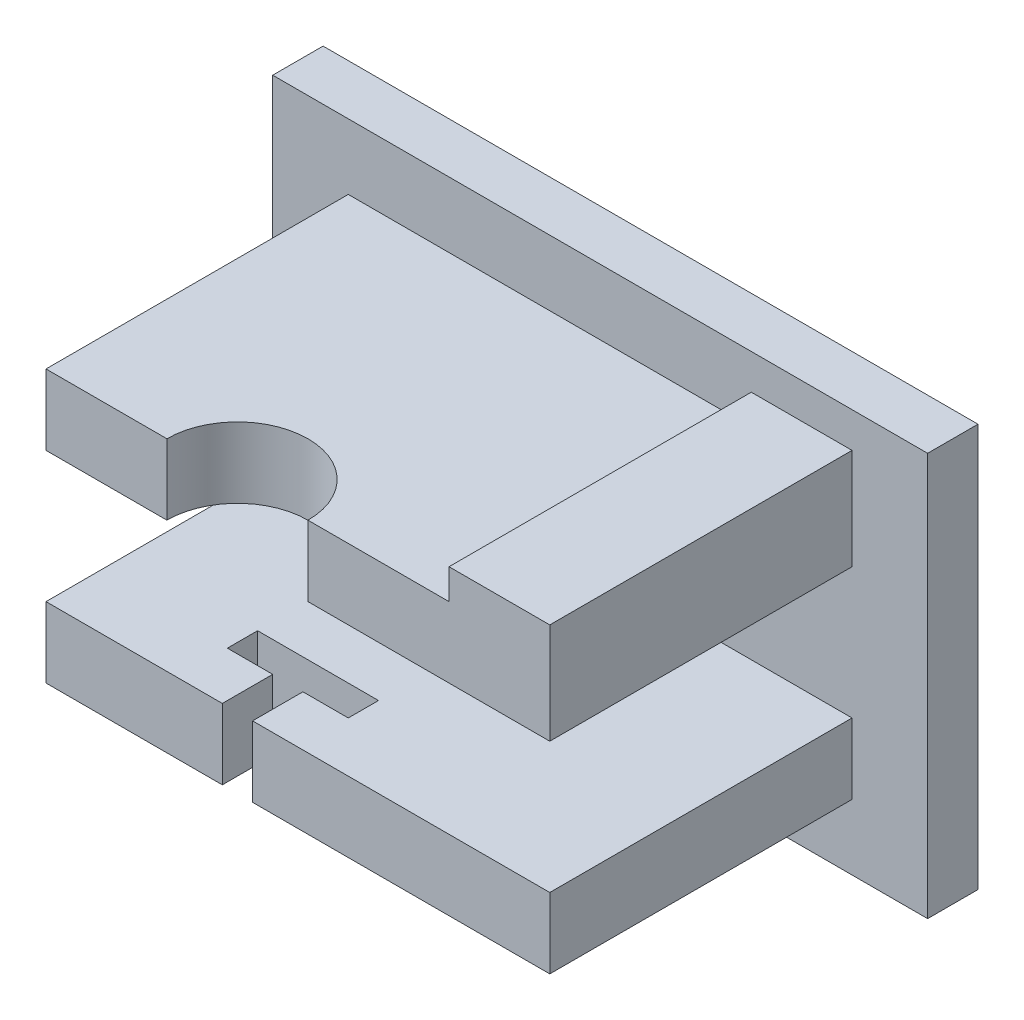
ISO-10303-21;
HEADER;
FILE_DESCRIPTION(('STEP AP214'),'2;1');
FILE_NAME('part.step','',(''),(''),'','','');
FILE_SCHEMA(('AUTOMOTIVE_DESIGN { 1 0 10303 214 1 1 1 1 }'));
ENDSEC;
DATA;
#1=APPLICATION_CONTEXT('core data for automotive mechanical design processes');
#2=APPLICATION_PROTOCOL_DEFINITION('international standard','automotive_design',2000,#1);
#3=PRODUCT_CONTEXT('',#1,'mechanical');
#4=PRODUCT('Part','Part','',(#3));
#5=PRODUCT_RELATED_PRODUCT_CATEGORY('part','',(#4));
#6=PRODUCT_DEFINITION_FORMATION('','',#4);
#7=PRODUCT_DEFINITION_CONTEXT('part definition',#1,'design');
#8=PRODUCT_DEFINITION('design','',#6,#7);
#9=PRODUCT_DEFINITION_SHAPE('','',#8);
#10=(LENGTH_UNIT() NAMED_UNIT(*) SI_UNIT(.MILLI.,.METRE.));
#11=(NAMED_UNIT(*) PLANE_ANGLE_UNIT() SI_UNIT($,.RADIAN.));
#12=(NAMED_UNIT(*) SI_UNIT($,.STERADIAN.) SOLID_ANGLE_UNIT());
#13=UNCERTAINTY_MEASURE_WITH_UNIT(LENGTH_MEASURE(1.E-05),#10,'distance_accuracy_value','');
#14=(GEOMETRIC_REPRESENTATION_CONTEXT(3) GLOBAL_UNCERTAINTY_ASSIGNED_CONTEXT((#13)) GLOBAL_UNIT_ASSIGNED_CONTEXT((#10,
#11,#12)) REPRESENTATION_CONTEXT('',''));
#15=CARTESIAN_POINT('',(0.,0.,0.));
#16=DIRECTION('',(0.,0.,1.));
#17=DIRECTION('',(1.,0.,0.));
#18=AXIS2_PLACEMENT_3D('',#15,#16,#17);
#19=CARTESIAN_POINT('',(0.,0.,35.));
#20=DIRECTION('',(0.,0.,1.));
#21=DIRECTION('',(1.,0.,0.));
#22=AXIS2_PLACEMENT_3D('',#19,#20,#21);
#23=PLANE('',#22);
#24=DIRECTION('',(1.,0.,0.));
#25=VECTOR('',#24,1.);
#26=CARTESIAN_POINT('',(0.,-13.5,35.));
#27=LINE('',#26,#25);
#28=CARTESIAN_POINT('',(-25.,-13.5,35.));
#29=VERTEX_POINT('',#28);
#30=CARTESIAN_POINT('',(-7.5,-13.5,35.));
#31=VERTEX_POINT('',#30);
#32=EDGE_CURVE('E362',#29,#31,#27,.T.);
#33=ORIENTED_EDGE('',*,*,#32,.T.);
#34=DIRECTION('',(0.,-1.,0.));
#35=VECTOR('',#34,1.);
#36=CARTESIAN_POINT('',(-7.5,5.86931687685299,35.));
#37=LINE('',#36,#35);
#38=CARTESIAN_POINT('',(-7.5,-6.5,35.));
#39=VERTEX_POINT('',#38);
#40=EDGE_CURVE('E335',#39,#31,#37,.T.);
#41=ORIENTED_EDGE('',*,*,#40,.F.);
#42=DIRECTION('',(1.,0.,0.));
#43=VECTOR('',#42,1.);
#44=CARTESIAN_POINT('',(0.,-6.5,35.));
#45=LINE('',#44,#43);
#46=CARTESIAN_POINT('',(-25.,-6.5,35.));
#47=VERTEX_POINT('',#46);
#48=EDGE_CURVE('E366',#47,#39,#45,.T.);
#49=ORIENTED_EDGE('',*,*,#48,.F.);
#50=DIRECTION('',(0.,1.,0.));
#51=VECTOR('',#50,1.);
#52=CARTESIAN_POINT('',(-25.,0.,35.));
#53=LINE('',#52,#51);
#54=EDGE_CURVE('E369',#29,#47,#53,.T.);
#55=ORIENTED_EDGE('',*,*,#54,.F.);
#56=EDGE_LOOP('',(#33,#41,#49,#55));
#57=FACE_BOUND('',#56,.T.);
#58=ADVANCED_FACE('F60',(#57),#23,.T.);
#59=CARTESIAN_POINT('',(0.,0.,35.));
#60=DIRECTION('',(0.,0.,1.));
#61=DIRECTION('',(1.,0.,0.));
#62=AXIS2_PLACEMENT_3D('',#59,#60,#61);
#63=PLANE('',#62);
#64=DIRECTION('',(0.,1.,0.));
#65=VECTOR('',#64,1.);
#66=CARTESIAN_POINT('',(0.999999999999996,-13.2989898732233,35.));
#67=LINE('',#66,#65);
#68=CARTESIAN_POINT('',(0.999999999999993,6.5,35.));
#69=VERTEX_POINT('',#68);
#70=CARTESIAN_POINT('',(0.999999999999992,13.5,35.));
#71=VERTEX_POINT('',#70);
#72=EDGE_CURVE('E12',#69,#71,#67,.T.);
#73=ORIENTED_EDGE('',*,*,#72,.F.);
#74=DIRECTION('',(-1.,0.,0.));
#75=VECTOR('',#74,1.);
#76=CARTESIAN_POINT('',(0.,6.5,35.));
#77=LINE('',#76,#75);
#78=CARTESIAN_POINT('',(25.,6.5,35.));
#79=VERTEX_POINT('',#78);
#80=EDGE_CURVE('E398',#79,#69,#77,.T.);
#81=ORIENTED_EDGE('',*,*,#80,.F.);
#82=DIRECTION('',(0.,1.,0.));
#83=VECTOR('',#82,1.);
#84=CARTESIAN_POINT('',(25.,0.,35.));
#85=LINE('',#84,#83);
#86=CARTESIAN_POINT('',(25.,16.5,35.));
#87=VERTEX_POINT('',#86);
#88=EDGE_CURVE('E401',#79,#87,#85,.T.);
#89=ORIENTED_EDGE('',*,*,#88,.T.);
#90=DIRECTION('',(-1.,0.,0.));
#91=VECTOR('',#90,1.);
#92=CARTESIAN_POINT('',(0.,16.5,35.));
#93=LINE('',#92,#91);
#94=CARTESIAN_POINT('',(15.,16.5,35.));
#95=VERTEX_POINT('',#94);
#96=EDGE_CURVE('E403',#87,#95,#93,.T.);
#97=ORIENTED_EDGE('',*,*,#96,.T.);
#98=DIRECTION('',(0.,-1.,0.));
#99=VECTOR('',#98,1.);
#100=CARTESIAN_POINT('',(15.,0.,35.));
#101=LINE('',#100,#99);
#102=CARTESIAN_POINT('',(15.,13.5,35.));
#103=VERTEX_POINT('',#102);
#104=EDGE_CURVE('E405',#95,#103,#101,.T.);
#105=ORIENTED_EDGE('',*,*,#104,.T.);
#106=DIRECTION('',(-1.,0.,0.));
#107=VECTOR('',#106,1.);
#108=CARTESIAN_POINT('',(0.,13.5,35.));
#109=LINE('',#108,#107);
#110=EDGE_CURVE('E408',#103,#71,#109,.T.);
#111=ORIENTED_EDGE('',*,*,#110,.T.);
#112=EDGE_LOOP('',(#73,#81,#89,#97,#105,#111));
#113=FACE_BOUND('',#112,.T.);
#114=ADVANCED_FACE('F306',(#113),#63,.T.);
#115=CARTESIAN_POINT('',(0.,0.,5.));
#116=DIRECTION('',(0.,0.,-1.));
#117=DIRECTION('',(-1.,0.,0.));
#118=AXIS2_PLACEMENT_3D('',#115,#116,#117);
#119=PLANE('',#118);
#120=DIRECTION('',(0.,1.,0.));
#121=VECTOR('',#120,1.);
#122=CARTESIAN_POINT('',(32.5,-20.,5.));
#123=LINE('',#122,#121);
#124=CARTESIAN_POINT('',(32.5,-20.,5.));
#125=VERTEX_POINT('',#124);
#126=CARTESIAN_POINT('',(32.5,20.,5.));
#127=VERTEX_POINT('',#126);
#128=EDGE_CURVE('E444',#125,#127,#123,.T.);
#129=ORIENTED_EDGE('',*,*,#128,.T.);
#130=DIRECTION('',(-1.,0.,0.));
#131=VECTOR('',#130,1.);
#132=CARTESIAN_POINT('',(-32.5,20.,5.));
#133=LINE('',#132,#131);
#134=CARTESIAN_POINT('',(-32.5,20.,5.));
#135=VERTEX_POINT('',#134);
#136=EDGE_CURVE('E447',#127,#135,#133,.T.);
#137=ORIENTED_EDGE('',*,*,#136,.T.);
#138=DIRECTION('',(0.,-1.,0.));
#139=VECTOR('',#138,1.);
#140=CARTESIAN_POINT('',(-32.5,-20.,5.));
#141=LINE('',#140,#139);
#142=CARTESIAN_POINT('',(-32.5,-20.,5.));
#143=VERTEX_POINT('',#142);
#144=EDGE_CURVE('E450',#135,#143,#141,.T.);
#145=ORIENTED_EDGE('',*,*,#144,.T.);
#146=DIRECTION('',(1.,0.,0.));
#147=VECTOR('',#146,1.);
#148=CARTESIAN_POINT('',(-32.5,-20.,5.));
#149=LINE('',#148,#147);
#150=EDGE_CURVE('E452',#143,#125,#149,.T.);
#151=ORIENTED_EDGE('',*,*,#150,.T.);
#152=EDGE_LOOP('',(#129,#137,#145,#151));
#153=FACE_BOUND('',#152,.T.);
#154=DIRECTION('',(-1.,0.,0.));
#155=VECTOR('',#154,1.);
#156=CARTESIAN_POINT('',(0.,6.5,5.));
#157=LINE('',#156,#155);
#158=CARTESIAN_POINT('',(25.,6.5,5.));
#159=VERTEX_POINT('',#158);
#160=CARTESIAN_POINT('',(-25.,6.49999999999999,5.));
#161=VERTEX_POINT('',#160);
#162=EDGE_CURVE('E413',#159,#161,#157,.T.);
#163=ORIENTED_EDGE('',*,*,#162,.T.);
#164=DIRECTION('',(0.,1.,0.));
#165=VECTOR('',#164,1.);
#166=CARTESIAN_POINT('',(-25.,0.,5.));
#167=LINE('',#166,#165);
#168=CARTESIAN_POINT('',(-25.,13.5,5.));
#169=VERTEX_POINT('',#168);
#170=EDGE_CURVE('E392',#161,#169,#167,.T.);
#171=ORIENTED_EDGE('',*,*,#170,.T.);
#172=DIRECTION('',(-1.,0.,0.));
#173=VECTOR('',#172,1.);
#174=CARTESIAN_POINT('',(0.,13.5,5.));
#175=LINE('',#174,#173);
#176=CARTESIAN_POINT('',(15.,13.5,5.));
#177=VERTEX_POINT('',#176);
#178=EDGE_CURVE('E397',#177,#169,#175,.T.);
#179=ORIENTED_EDGE('',*,*,#178,.F.);
#180=DIRECTION('',(0.,-1.,0.));
#181=VECTOR('',#180,1.);
#182=CARTESIAN_POINT('',(15.,0.,5.));
#183=LINE('',#182,#181);
#184=CARTESIAN_POINT('',(15.,16.5,5.));
#185=VERTEX_POINT('',#184);
#186=EDGE_CURVE('E421',#185,#177,#183,.T.);
#187=ORIENTED_EDGE('',*,*,#186,.F.);
#188=DIRECTION('',(-1.,0.,0.));
#189=VECTOR('',#188,1.);
#190=CARTESIAN_POINT('',(0.,16.5,5.));
#191=LINE('',#190,#189);
#192=CARTESIAN_POINT('',(25.,16.5,5.));
#193=VERTEX_POINT('',#192);
#194=EDGE_CURVE('E418',#193,#185,#191,.T.);
#195=ORIENTED_EDGE('',*,*,#194,.F.);
#196=DIRECTION('',(0.,1.,0.));
#197=VECTOR('',#196,1.);
#198=CARTESIAN_POINT('',(25.,0.,5.));
#199=LINE('',#198,#197);
#200=EDGE_CURVE('E415',#159,#193,#199,.T.);
#201=ORIENTED_EDGE('',*,*,#200,.F.);
#202=EDGE_LOOP('',(#163,#171,#179,#187,#195,#201));
#203=FACE_BOUND('',#202,.T.);
#204=DIRECTION('',(1.,0.,0.));
#205=VECTOR('',#204,1.);
#206=CARTESIAN_POINT('',(0.,-13.5,5.));
#207=LINE('',#206,#205);
#208=CARTESIAN_POINT('',(-25.,-13.5,5.));
#209=VERTEX_POINT('',#208);
#210=CARTESIAN_POINT('',(25.,-13.5,5.));
#211=VERTEX_POINT('',#210);
#212=EDGE_CURVE('E361',#209,#211,#207,.T.);
#213=ORIENTED_EDGE('',*,*,#212,.F.);
#214=DIRECTION('',(0.,1.,0.));
#215=VECTOR('',#214,1.);
#216=CARTESIAN_POINT('',(-25.,0.,5.));
#217=LINE('',#216,#215);
#218=CARTESIAN_POINT('',(-25.,-6.5,5.));
#219=VERTEX_POINT('',#218);
#220=EDGE_CURVE('E381',#209,#219,#217,.T.);
#221=ORIENTED_EDGE('',*,*,#220,.T.);
#222=DIRECTION('',(1.,0.,0.));
#223=VECTOR('',#222,1.);
#224=CARTESIAN_POINT('',(0.,-6.5,5.));
#225=LINE('',#224,#223);
#226=CARTESIAN_POINT('',(25.,-6.5,5.));
#227=VERTEX_POINT('',#226);
#228=EDGE_CURVE('E378',#219,#227,#225,.T.);
#229=ORIENTED_EDGE('',*,*,#228,.T.);
#230=DIRECTION('',(0.,1.,0.));
#231=VECTOR('',#230,1.);
#232=CARTESIAN_POINT('',(25.,0.,5.));
#233=LINE('',#232,#231);
#234=EDGE_CURVE('E375',#211,#227,#233,.T.);
#235=ORIENTED_EDGE('',*,*,#234,.F.);
#236=EDGE_LOOP('',(#213,#221,#229,#235));
#237=FACE_BOUND('',#236,.T.);
#238=ADVANCED_FACE('F314',(#153,#203,#237),#119,.F.);
#239=CARTESIAN_POINT('',(32.5,-20.,5.));
#240=DIRECTION('',(-1.,0.,0.));
#241=DIRECTION('',(0.,0.,1.));
#242=AXIS2_PLACEMENT_3D('',#239,#240,#241);
#243=PLANE('',#242);
#244=DIRECTION('',(0.,1.,0.));
#245=VECTOR('',#244,1.);
#246=CARTESIAN_POINT('',(32.5,-20.,0.));
#247=LINE('',#246,#245);
#248=CARTESIAN_POINT('',(32.5,-20.,0.));
#249=VERTEX_POINT('',#248);
#250=CARTESIAN_POINT('',(32.5,20.,0.));
#251=VERTEX_POINT('',#250);
#252=EDGE_CURVE('E443',#249,#251,#247,.T.);
#253=ORIENTED_EDGE('',*,*,#252,.T.);
#254=DIRECTION('',(0.,0.,-1.));
#255=VECTOR('',#254,1.);
#256=CARTESIAN_POINT('',(32.5,20.,5.));
#257=LINE('',#256,#255);
#258=EDGE_CURVE('E470',#127,#251,#257,.T.);
#259=ORIENTED_EDGE('',*,*,#258,.F.);
#260=ORIENTED_EDGE('',*,*,#128,.F.);
#261=DIRECTION('',(0.,0.,-1.));
#262=VECTOR('',#261,1.);
#263=CARTESIAN_POINT('',(32.5,-20.,5.));
#264=LINE('',#263,#262);
#265=EDGE_CURVE('E454',#125,#249,#264,.T.);
#266=ORIENTED_EDGE('',*,*,#265,.T.);
#267=EDGE_LOOP('',(#253,#259,#260,#266));
#268=FACE_BOUND('',#267,.T.);
#269=ADVANCED_FACE('F62',(#268),#243,.F.);
#270=CARTESIAN_POINT('',(-32.5,20.,5.));
#271=DIRECTION('',(0.,-1.,0.));
#272=DIRECTION('',(0.,0.,-1.));
#273=AXIS2_PLACEMENT_3D('',#270,#271,#272);
#274=PLANE('',#273);
#275=DIRECTION('',(-1.,0.,0.));
#276=VECTOR('',#275,1.);
#277=CARTESIAN_POINT('',(-32.5,20.,0.));
#278=LINE('',#277,#276);
#279=CARTESIAN_POINT('',(-32.5,20.,0.));
#280=VERTEX_POINT('',#279);
#281=EDGE_CURVE('E457',#251,#280,#278,.T.);
#282=ORIENTED_EDGE('',*,*,#281,.T.);
#283=DIRECTION('',(0.,0.,-1.));
#284=VECTOR('',#283,1.);
#285=CARTESIAN_POINT('',(-32.5,20.,5.));
#286=LINE('',#285,#284);
#287=EDGE_CURVE('E467',#135,#280,#286,.T.);
#288=ORIENTED_EDGE('',*,*,#287,.F.);
#289=ORIENTED_EDGE('',*,*,#136,.F.);
#290=ORIENTED_EDGE('',*,*,#258,.T.);
#291=EDGE_LOOP('',(#282,#288,#289,#290));
#292=FACE_BOUND('',#291,.T.);
#293=ADVANCED_FACE('F528',(#292),#274,.F.);
#294=CARTESIAN_POINT('',(-32.5,-20.,5.));
#295=DIRECTION('',(1.,0.,0.));
#296=DIRECTION('',(0.,0.,-1.));
#297=AXIS2_PLACEMENT_3D('',#294,#295,#296);
#298=PLANE('',#297);
#299=DIRECTION('',(0.,-1.,0.));
#300=VECTOR('',#299,1.);
#301=CARTESIAN_POINT('',(-32.5,-20.,0.));
#302=LINE('',#301,#300);
#303=CARTESIAN_POINT('',(-32.5,-20.,0.));
#304=VERTEX_POINT('',#303);
#305=EDGE_CURVE('E459',#280,#304,#302,.T.);
#306=ORIENTED_EDGE('',*,*,#305,.T.);
#307=DIRECTION('',(0.,0.,-1.));
#308=VECTOR('',#307,1.);
#309=CARTESIAN_POINT('',(-32.5,-20.,5.));
#310=LINE('',#309,#308);
#311=EDGE_CURVE('E464',#143,#304,#310,.T.);
#312=ORIENTED_EDGE('',*,*,#311,.F.);
#313=ORIENTED_EDGE('',*,*,#144,.F.);
#314=ORIENTED_EDGE('',*,*,#287,.T.);
#315=EDGE_LOOP('',(#306,#312,#313,#314));
#316=FACE_BOUND('',#315,.T.);
#317=ADVANCED_FACE('F525',(#316),#298,.F.);
#318=CARTESIAN_POINT('',(-32.5,-20.,5.));
#319=DIRECTION('',(0.,1.,0.));
#320=DIRECTION('',(0.,0.,1.));
#321=AXIS2_PLACEMENT_3D('',#318,#319,#320);
#322=PLANE('',#321);
#323=DIRECTION('',(1.,0.,0.));
#324=VECTOR('',#323,1.);
#325=CARTESIAN_POINT('',(-32.5,-20.,0.));
#326=LINE('',#325,#324);
#327=EDGE_CURVE('E448',#304,#249,#326,.T.);
#328=ORIENTED_EDGE('',*,*,#327,.T.);
#329=ORIENTED_EDGE('',*,*,#265,.F.);
#330=ORIENTED_EDGE('',*,*,#150,.F.);
#331=ORIENTED_EDGE('',*,*,#311,.T.);
#332=EDGE_LOOP('',(#328,#329,#330,#331));
#333=FACE_BOUND('',#332,.T.);
#334=ADVANCED_FACE('F521',(#333),#322,.F.);
#335=CARTESIAN_POINT('',(0.,0.,0.));
#336=DIRECTION('',(0.,0.,-1.));
#337=DIRECTION('',(-1.,0.,0.));
#338=AXIS2_PLACEMENT_3D('',#335,#336,#337);
#339=PLANE('',#338);
#340=ORIENTED_EDGE('',*,*,#252,.F.);
#341=ORIENTED_EDGE('',*,*,#327,.F.);
#342=ORIENTED_EDGE('',*,*,#305,.F.);
#343=ORIENTED_EDGE('',*,*,#281,.F.);
#344=EDGE_LOOP('',(#340,#341,#342,#343));
#345=FACE_BOUND('',#344,.T.);
#346=ADVANCED_FACE('F515',(#345),#339,.T.);
#347=CARTESIAN_POINT('',(-25.,0.,35.));
#348=DIRECTION('',(-1.,0.,0.));
#349=DIRECTION('',(0.,-1.,0.));
#350=AXIS2_PLACEMENT_3D('',#347,#348,#349);
#351=PLANE('',#350);
#352=ORIENTED_EDGE('',*,*,#170,.F.);
#353=DIRECTION('',(0.,0.,-1.));
#354=VECTOR('',#353,1.);
#355=CARTESIAN_POINT('',(-25.,6.49999999999999,35.));
#356=LINE('',#355,#354);
#357=CARTESIAN_POINT('',(-25.,6.49999999999999,35.));
#358=VERTEX_POINT('',#357);
#359=EDGE_CURVE('E440',#358,#161,#356,.T.);
#360=ORIENTED_EDGE('',*,*,#359,.F.);
#361=DIRECTION('',(0.,1.,0.));
#362=VECTOR('',#361,1.);
#363=CARTESIAN_POINT('',(-25.,0.,35.));
#364=LINE('',#363,#362);
#365=CARTESIAN_POINT('',(-25.,13.5,35.));
#366=VERTEX_POINT('',#365);
#367=EDGE_CURVE('E393',#358,#366,#364,.T.);
#368=ORIENTED_EDGE('',*,*,#367,.T.);
#369=DIRECTION('',(0.,0.,-1.));
#370=VECTOR('',#369,1.);
#371=CARTESIAN_POINT('',(-25.,13.5,35.));
#372=LINE('',#371,#370);
#373=EDGE_CURVE('E411',#366,#169,#372,.T.);
#374=ORIENTED_EDGE('',*,*,#373,.T.);
#375=EDGE_LOOP('',(#352,#360,#368,#374));
#376=FACE_BOUND('',#375,.T.);
#377=ADVANCED_FACE('F483',(#376),#351,.T.);
#378=CARTESIAN_POINT('',(0.,6.5,35.));
#379=DIRECTION('',(0.,-1.,0.));
#380=DIRECTION('',(1.,0.,0.));
#381=AXIS2_PLACEMENT_3D('',#378,#379,#380);
#382=PLANE('',#381);
#383=CARTESIAN_POINT('',(-6.00000000000001,6.5,35.));
#384=DIRECTION('',(0.,-1.,0.));
#385=DIRECTION('',(1.,0.,0.));
#386=AXIS2_PLACEMENT_3D('',#383,#384,#385);
#387=CIRCLE('',#386,7.);
#388=CARTESIAN_POINT('',(-13.,6.49999999999999,35.));
#389=VERTEX_POINT('',#388);
#390=EDGE_CURVE('E357',#69,#389,#387,.F.);
#391=ORIENTED_EDGE('',*,*,#390,.T.);
#392=EDGE_CURVE('E396',#389,#358,#77,.T.);
#393=ORIENTED_EDGE('',*,*,#392,.T.);
#394=ORIENTED_EDGE('',*,*,#359,.T.);
#395=ORIENTED_EDGE('',*,*,#162,.F.);
#396=DIRECTION('',(0.,0.,-1.));
#397=VECTOR('',#396,1.);
#398=CARTESIAN_POINT('',(25.,6.5,35.));
#399=LINE('',#398,#397);
#400=EDGE_CURVE('E437',#79,#159,#399,.T.);
#401=ORIENTED_EDGE('',*,*,#400,.F.);
#402=ORIENTED_EDGE('',*,*,#80,.T.);
#403=EDGE_LOOP('',(#391,#393,#394,#395,#401,#402));
#404=FACE_BOUND('',#403,.T.);
#405=ADVANCED_FACE('F476',(#404),#382,.T.);
#406=CARTESIAN_POINT('',(25.,0.,35.));
#407=DIRECTION('',(-1.,0.,0.));
#408=DIRECTION('',(0.,0.,1.));
#409=AXIS2_PLACEMENT_3D('',#406,#407,#408);
#410=PLANE('',#409);
#411=ORIENTED_EDGE('',*,*,#200,.T.);
#412=DIRECTION('',(0.,0.,-1.));
#413=VECTOR('',#412,1.);
#414=CARTESIAN_POINT('',(25.,16.5,35.));
#415=LINE('',#414,#413);
#416=EDGE_CURVE('E434',#87,#193,#415,.T.);
#417=ORIENTED_EDGE('',*,*,#416,.F.);
#418=ORIENTED_EDGE('',*,*,#88,.F.);
#419=ORIENTED_EDGE('',*,*,#400,.T.);
#420=EDGE_LOOP('',(#411,#417,#418,#419));
#421=FACE_BOUND('',#420,.T.);
#422=ADVANCED_FACE('F490',(#421),#410,.F.);
#423=CARTESIAN_POINT('',(0.,16.5,35.));
#424=DIRECTION('',(0.,-1.,0.));
#425=DIRECTION('',(0.,0.,-1.));
#426=AXIS2_PLACEMENT_3D('',#423,#424,#425);
#427=PLANE('',#426);
#428=ORIENTED_EDGE('',*,*,#194,.T.);
#429=DIRECTION('',(0.,0.,-1.));
#430=VECTOR('',#429,1.);
#431=CARTESIAN_POINT('',(15.,16.5,35.));
#432=LINE('',#431,#430);
#433=EDGE_CURVE('E431',#95,#185,#432,.T.);
#434=ORIENTED_EDGE('',*,*,#433,.F.);
#435=ORIENTED_EDGE('',*,*,#96,.F.);
#436=ORIENTED_EDGE('',*,*,#416,.T.);
#437=EDGE_LOOP('',(#428,#434,#435,#436));
#438=FACE_BOUND('',#437,.T.);
#439=ADVANCED_FACE('F500',(#438),#427,.F.);
#440=CARTESIAN_POINT('',(15.,0.,35.));
#441=DIRECTION('',(1.,0.,0.));
#442=DIRECTION('',(0.,0.,-1.));
#443=AXIS2_PLACEMENT_3D('',#440,#441,#442);
#444=PLANE('',#443);
#445=ORIENTED_EDGE('',*,*,#186,.T.);
#446=DIRECTION('',(0.,0.,-1.));
#447=VECTOR('',#446,1.);
#448=CARTESIAN_POINT('',(15.,13.5,35.));
#449=LINE('',#448,#447);
#450=EDGE_CURVE('E428',#103,#177,#449,.T.);
#451=ORIENTED_EDGE('',*,*,#450,.F.);
#452=ORIENTED_EDGE('',*,*,#104,.F.);
#453=ORIENTED_EDGE('',*,*,#433,.T.);
#454=EDGE_LOOP('',(#445,#451,#452,#453));
#455=FACE_BOUND('',#454,.T.);
#456=ADVANCED_FACE('F496',(#455),#444,.F.);
#457=CARTESIAN_POINT('',(0.,13.5,35.));
#458=DIRECTION('',(0.,-1.,0.));
#459=DIRECTION('',(1.,0.,0.));
#460=AXIS2_PLACEMENT_3D('',#457,#458,#459);
#461=PLANE('',#460);
#462=CARTESIAN_POINT('',(-13.,13.5,35.));
#463=VERTEX_POINT('',#462);
#464=EDGE_CURVE('E407',#463,#366,#109,.T.);
#465=ORIENTED_EDGE('',*,*,#464,.F.);
#466=CARTESIAN_POINT('',(-6.00000000000001,13.5,35.));
#467=DIRECTION('',(0.,1.,0.));
#468=DIRECTION('',(-1.,0.,0.));
#469=AXIS2_PLACEMENT_3D('',#466,#467,#468);
#470=CIRCLE('',#469,7.);
#471=EDGE_CURVE('E82',#71,#463,#470,.T.);
#472=ORIENTED_EDGE('',*,*,#471,.F.);
#473=ORIENTED_EDGE('',*,*,#110,.F.);
#474=ORIENTED_EDGE('',*,*,#450,.T.);
#475=ORIENTED_EDGE('',*,*,#178,.T.);
#476=ORIENTED_EDGE('',*,*,#373,.F.);
#477=EDGE_LOOP('',(#465,#472,#473,#474,#475,#476));
#478=FACE_BOUND('',#477,.T.);
#479=ADVANCED_FACE('F303',(#478),#461,.F.);
#480=DIRECTION('',(0.,1.,0.));
#481=VECTOR('',#480,1.);
#482=CARTESIAN_POINT('',(-13.,-13.2989898732233,35.));
#483=LINE('',#482,#481);
#484=EDGE_CURVE('E68',#463,#389,#483,.F.);
#485=ORIENTED_EDGE('',*,*,#484,.F.);
#486=ORIENTED_EDGE('',*,*,#464,.T.);
#487=ORIENTED_EDGE('',*,*,#367,.F.);
#488=ORIENTED_EDGE('',*,*,#392,.F.);
#489=EDGE_LOOP('',(#485,#486,#487,#488));
#490=FACE_BOUND('',#489,.T.);
#491=ADVANCED_FACE('F295',(#490),#63,.T.);
#492=CARTESIAN_POINT('',(0.,-13.5,35.));
#493=DIRECTION('',(0.,1.,0.));
#494=DIRECTION('',(0.,0.,1.));
#495=AXIS2_PLACEMENT_3D('',#492,#493,#494);
#496=PLANE('',#495);
#497=CARTESIAN_POINT('',(-4.5,-13.5,35.));
#498=VERTEX_POINT('',#497);
#499=CARTESIAN_POINT('',(25.,-13.5,35.));
#500=VERTEX_POINT('',#499);
#501=EDGE_CURVE('E292',#498,#500,#27,.T.);
#502=ORIENTED_EDGE('',*,*,#501,.F.);
#503=DIRECTION('',(0.,0.,1.));
#504=VECTOR('',#503,1.);
#505=CARTESIAN_POINT('',(-4.5,-13.5,30.));
#506=LINE('',#505,#504);
#507=CARTESIAN_POINT('',(-4.5,-13.5,30.));
#508=VERTEX_POINT('',#507);
#509=EDGE_CURVE('E339',#508,#498,#506,.T.);
#510=ORIENTED_EDGE('',*,*,#509,.F.);
#511=DIRECTION('',(1.,0.,0.));
#512=VECTOR('',#511,1.);
#513=CARTESIAN_POINT('',(0.,-13.5,30.));
#514=LINE('',#513,#512);
#515=CARTESIAN_POINT('',(0.,-13.5,30.));
#516=VERTEX_POINT('',#515);
#517=EDGE_CURVE('E265',#508,#516,#514,.T.);
#518=ORIENTED_EDGE('',*,*,#517,.T.);
#519=DIRECTION('',(0.,0.,1.));
#520=VECTOR('',#519,1.);
#521=CARTESIAN_POINT('',(0.,-13.5,0.));
#522=LINE('',#521,#520);
#523=CARTESIAN_POINT('',(0.,-13.5,27.));
#524=VERTEX_POINT('',#523);
#525=EDGE_CURVE('E238',#524,#516,#522,.T.);
#526=ORIENTED_EDGE('',*,*,#525,.F.);
#527=DIRECTION('',(1.,0.,0.));
#528=VECTOR('',#527,1.);
#529=CARTESIAN_POINT('',(0.,-13.5,27.));
#530=LINE('',#529,#528);
#531=CARTESIAN_POINT('',(-12.,-13.5,27.));
#532=VERTEX_POINT('',#531);
#533=EDGE_CURVE('E247',#532,#524,#530,.T.);
#534=ORIENTED_EDGE('',*,*,#533,.F.);
#535=DIRECTION('',(0.,0.,1.));
#536=VECTOR('',#535,1.);
#537=CARTESIAN_POINT('',(-12.,-13.5,0.));
#538=LINE('',#537,#536);
#539=CARTESIAN_POINT('',(-12.,-13.5,30.));
#540=VERTEX_POINT('',#539);
#541=EDGE_CURVE('E253',#532,#540,#538,.T.);
#542=ORIENTED_EDGE('',*,*,#541,.T.);
#543=CARTESIAN_POINT('',(-7.5,-13.5,30.));
#544=VERTEX_POINT('',#543);
#545=EDGE_CURVE('E270',#540,#544,#514,.T.);
#546=ORIENTED_EDGE('',*,*,#545,.T.);
#547=DIRECTION('',(0.,0.,1.));
#548=VECTOR('',#547,1.);
#549=CARTESIAN_POINT('',(-7.5,-13.5,30.));
#550=LINE('',#549,#548);
#551=EDGE_CURVE('E255',#544,#31,#550,.T.);
#552=ORIENTED_EDGE('',*,*,#551,.T.);
#553=ORIENTED_EDGE('',*,*,#32,.F.);
#554=DIRECTION('',(0.,0.,-1.));
#555=VECTOR('',#554,1.);
#556=CARTESIAN_POINT('',(-25.,-13.5,35.));
#557=LINE('',#556,#555);
#558=EDGE_CURVE('E372',#29,#209,#557,.T.);
#559=ORIENTED_EDGE('',*,*,#558,.T.);
#560=ORIENTED_EDGE('',*,*,#212,.T.);
#561=DIRECTION('',(0.,0.,-1.));
#562=VECTOR('',#561,1.);
#563=CARTESIAN_POINT('',(25.,-13.5,35.));
#564=LINE('',#563,#562);
#565=EDGE_CURVE('E390',#500,#211,#564,.T.);
#566=ORIENTED_EDGE('',*,*,#565,.F.);
#567=EDGE_LOOP('',(#502,#510,#518,#526,#534,#542,#546,#552,#553,#559,#560,#566));
#568=FACE_BOUND('',#567,.T.);
#569=ADVANCED_FACE('F290',(#568),#496,.F.);
#570=CARTESIAN_POINT('',(25.,0.,35.));
#571=DIRECTION('',(-1.,0.,0.));
#572=DIRECTION('',(0.,0.,1.));
#573=AXIS2_PLACEMENT_3D('',#570,#571,#572);
#574=PLANE('',#573);
#575=ORIENTED_EDGE('',*,*,#234,.T.);
#576=DIRECTION('',(0.,0.,-1.));
#577=VECTOR('',#576,1.);
#578=CARTESIAN_POINT('',(25.,-6.5,35.));
#579=LINE('',#578,#577);
#580=CARTESIAN_POINT('',(25.,-6.5,35.));
#581=VERTEX_POINT('',#580);
#582=EDGE_CURVE('E388',#581,#227,#579,.T.);
#583=ORIENTED_EDGE('',*,*,#582,.F.);
#584=DIRECTION('',(0.,1.,0.));
#585=VECTOR('',#584,1.);
#586=CARTESIAN_POINT('',(25.,0.,35.));
#587=LINE('',#586,#585);
#588=EDGE_CURVE('E364',#500,#581,#587,.T.);
#589=ORIENTED_EDGE('',*,*,#588,.F.);
#590=ORIENTED_EDGE('',*,*,#565,.T.);
#591=EDGE_LOOP('',(#575,#583,#589,#590));
#592=FACE_BOUND('',#591,.T.);
#593=ADVANCED_FACE('F294',(#592),#574,.F.);
#594=CARTESIAN_POINT('',(0.,-6.5,35.));
#595=DIRECTION('',(0.,1.,0.));
#596=DIRECTION('',(0.,0.,1.));
#597=AXIS2_PLACEMENT_3D('',#594,#595,#596);
#598=PLANE('',#597);
#599=DIRECTION('',(0.,0.,1.));
#600=VECTOR('',#599,1.);
#601=CARTESIAN_POINT('',(-4.5,-6.5,30.));
#602=LINE('',#601,#600);
#603=CARTESIAN_POINT('',(-4.5,-6.5,30.));
#604=VERTEX_POINT('',#603);
#605=CARTESIAN_POINT('',(-4.5,-6.5,35.));
#606=VERTEX_POINT('',#605);
#607=EDGE_CURVE('E336',#604,#606,#602,.T.);
#608=ORIENTED_EDGE('',*,*,#607,.T.);
#609=EDGE_CURVE('E333',#606,#581,#45,.T.);
#610=ORIENTED_EDGE('',*,*,#609,.T.);
#611=ORIENTED_EDGE('',*,*,#582,.T.);
#612=ORIENTED_EDGE('',*,*,#228,.F.);
#613=DIRECTION('',(0.,0.,-1.));
#614=VECTOR('',#613,1.);
#615=CARTESIAN_POINT('',(-25.,-6.5,35.));
#616=LINE('',#615,#614);
#617=EDGE_CURVE('E385',#47,#219,#616,.T.);
#618=ORIENTED_EDGE('',*,*,#617,.F.);
#619=ORIENTED_EDGE('',*,*,#48,.T.);
#620=DIRECTION('',(0.,0.,1.));
#621=VECTOR('',#620,1.);
#622=CARTESIAN_POINT('',(-7.5,-6.5,30.));
#623=LINE('',#622,#621);
#624=CARTESIAN_POINT('',(-7.5,-6.5,30.));
#625=VERTEX_POINT('',#624);
#626=EDGE_CURVE('E75',#625,#39,#623,.T.);
#627=ORIENTED_EDGE('',*,*,#626,.F.);
#628=DIRECTION('',(1.,0.,0.));
#629=VECTOR('',#628,1.);
#630=CARTESIAN_POINT('',(0.,-6.5,30.));
#631=LINE('',#630,#629);
#632=CARTESIAN_POINT('',(-12.,-6.5,30.));
#633=VERTEX_POINT('',#632);
#634=EDGE_CURVE('E230',#633,#625,#631,.T.);
#635=ORIENTED_EDGE('',*,*,#634,.F.);
#636=DIRECTION('',(0.,0.,1.));
#637=VECTOR('',#636,1.);
#638=CARTESIAN_POINT('',(-12.,-6.5,0.));
#639=LINE('',#638,#637);
#640=CARTESIAN_POINT('',(-12.,-6.5,27.));
#641=VERTEX_POINT('',#640);
#642=EDGE_CURVE('E231',#641,#633,#639,.T.);
#643=ORIENTED_EDGE('',*,*,#642,.F.);
#644=DIRECTION('',(1.,0.,0.));
#645=VECTOR('',#644,1.);
#646=CARTESIAN_POINT('',(0.,-6.5,27.));
#647=LINE('',#646,#645);
#648=CARTESIAN_POINT('',(0.,-6.5,27.));
#649=VERTEX_POINT('',#648);
#650=EDGE_CURVE('E245',#641,#649,#647,.T.);
#651=ORIENTED_EDGE('',*,*,#650,.T.);
#652=DIRECTION('',(0.,0.,1.));
#653=VECTOR('',#652,1.);
#654=CARTESIAN_POINT('',(0.,-6.5,0.));
#655=LINE('',#654,#653);
#656=CARTESIAN_POINT('',(0.,-6.5,30.));
#657=VERTEX_POINT('',#656);
#658=EDGE_CURVE('E235',#649,#657,#655,.T.);
#659=ORIENTED_EDGE('',*,*,#658,.T.);
#660=EDGE_CURVE('E219',#604,#657,#631,.T.);
#661=ORIENTED_EDGE('',*,*,#660,.F.);
#662=EDGE_LOOP('',(#608,#610,#611,#612,#618,#619,#627,#635,#643,#651,#659,#661));
#663=FACE_BOUND('',#662,.T.);
#664=ADVANCED_FACE('F243',(#663),#598,.T.);
#665=CARTESIAN_POINT('',(-25.,0.,35.));
#666=DIRECTION('',(-1.,0.,0.));
#667=DIRECTION('',(0.,0.,1.));
#668=AXIS2_PLACEMENT_3D('',#665,#666,#667);
#669=PLANE('',#668);
#670=ORIENTED_EDGE('',*,*,#220,.F.);
#671=ORIENTED_EDGE('',*,*,#558,.F.);
#672=ORIENTED_EDGE('',*,*,#54,.T.);
#673=ORIENTED_EDGE('',*,*,#617,.T.);
#674=EDGE_LOOP('',(#670,#671,#672,#673));
#675=FACE_BOUND('',#674,.T.);
#676=ADVANCED_FACE('F321',(#675),#669,.T.);
#677=DIRECTION('',(0.,-1.,0.));
#678=VECTOR('',#677,1.);
#679=CARTESIAN_POINT('',(-4.5,5.86931687685299,35.));
#680=LINE('',#679,#678);
#681=EDGE_CURVE('E330',#606,#498,#680,.T.);
#682=ORIENTED_EDGE('',*,*,#681,.T.);
#683=ORIENTED_EDGE('',*,*,#501,.T.);
#684=ORIENTED_EDGE('',*,*,#588,.T.);
#685=ORIENTED_EDGE('',*,*,#609,.F.);
#686=EDGE_LOOP('',(#682,#683,#684,#685));
#687=FACE_BOUND('',#686,.T.);
#688=ADVANCED_FACE('F310',(#687),#23,.T.);
#689=CARTESIAN_POINT('',(-6.,-13.2989898732233,35.));
#690=DIRECTION('',(0.,1.,0.));
#691=DIRECTION('',(-1.,0.,0.));
#692=AXIS2_PLACEMENT_3D('',#689,#690,#691);
#693=CYLINDRICAL_SURFACE('',#692,7.);
#694=ORIENTED_EDGE('',*,*,#72,.T.);
#695=ORIENTED_EDGE('',*,*,#471,.T.);
#696=ORIENTED_EDGE('',*,*,#484,.T.);
#697=ORIENTED_EDGE('',*,*,#390,.F.);
#698=EDGE_LOOP('',(#694,#695,#696,#697));
#699=FACE_BOUND('',#698,.T.);
#700=ADVANCED_FACE('F320',(#699),#693,.F.);
#701=CARTESIAN_POINT('',(0.,5.86931687685299,27.));
#702=DIRECTION('',(0.,0.,-1.));
#703=DIRECTION('',(-1.,0.,0.));
#704=AXIS2_PLACEMENT_3D('',#701,#702,#703);
#705=PLANE('',#704);
#706=DIRECTION('',(0.,-1.,0.));
#707=VECTOR('',#706,1.);
#708=CARTESIAN_POINT('',(-12.,5.86931687685299,27.));
#709=LINE('',#708,#707);
#710=EDGE_CURVE('E258',#641,#532,#709,.T.);
#711=ORIENTED_EDGE('',*,*,#710,.T.);
#712=ORIENTED_EDGE('',*,*,#533,.T.);
#713=DIRECTION('',(0.,-1.,0.));
#714=VECTOR('',#713,1.);
#715=CARTESIAN_POINT('',(0.,5.86931687685299,27.));
#716=LINE('',#715,#714);
#717=EDGE_CURVE('E252',#649,#524,#716,.T.);
#718=ORIENTED_EDGE('',*,*,#717,.F.);
#719=ORIENTED_EDGE('',*,*,#650,.F.);
#720=EDGE_LOOP('',(#711,#712,#718,#719));
#721=FACE_BOUND('',#720,.T.);
#722=ADVANCED_FACE('F287',(#721),#705,.F.);
#723=CARTESIAN_POINT('',(-12.,5.86931687685299,0.));
#724=DIRECTION('',(1.,0.,0.));
#725=DIRECTION('',(0.,0.,-1.));
#726=AXIS2_PLACEMENT_3D('',#723,#724,#725);
#727=PLANE('',#726);
#728=ORIENTED_EDGE('',*,*,#642,.T.);
#729=DIRECTION('',(0.,-1.,0.));
#730=VECTOR('',#729,1.);
#731=CARTESIAN_POINT('',(-12.,5.86931687685299,30.));
#732=LINE('',#731,#730);
#733=EDGE_CURVE('E240',#633,#540,#732,.T.);
#734=ORIENTED_EDGE('',*,*,#733,.T.);
#735=ORIENTED_EDGE('',*,*,#541,.F.);
#736=ORIENTED_EDGE('',*,*,#710,.F.);
#737=EDGE_LOOP('',(#728,#734,#735,#736));
#738=FACE_BOUND('',#737,.T.);
#739=ADVANCED_FACE('F288',(#738),#727,.T.);
#740=CARTESIAN_POINT('',(0.,5.86931687685299,0.));
#741=DIRECTION('',(1.,0.,0.));
#742=DIRECTION('',(0.,0.,-1.));
#743=AXIS2_PLACEMENT_3D('',#740,#741,#742);
#744=PLANE('',#743);
#745=ORIENTED_EDGE('',*,*,#717,.T.);
#746=ORIENTED_EDGE('',*,*,#525,.T.);
#747=DIRECTION('',(0.,-1.,0.));
#748=VECTOR('',#747,1.);
#749=CARTESIAN_POINT('',(0.,5.86931687685299,30.));
#750=LINE('',#749,#748);
#751=EDGE_CURVE('E223',#657,#516,#750,.T.);
#752=ORIENTED_EDGE('',*,*,#751,.F.);
#753=ORIENTED_EDGE('',*,*,#658,.F.);
#754=EDGE_LOOP('',(#745,#746,#752,#753));
#755=FACE_BOUND('',#754,.T.);
#756=ADVANCED_FACE('F234',(#755),#744,.F.);
#757=CARTESIAN_POINT('',(0.,5.86931687685299,30.));
#758=DIRECTION('',(0.,0.,-1.));
#759=DIRECTION('',(-1.,0.,0.));
#760=AXIS2_PLACEMENT_3D('',#757,#758,#759);
#761=PLANE('',#760);
#762=ORIENTED_EDGE('',*,*,#660,.T.);
#763=ORIENTED_EDGE('',*,*,#751,.T.);
#764=ORIENTED_EDGE('',*,*,#517,.F.);
#765=DIRECTION('',(0.,-1.,0.));
#766=VECTOR('',#765,1.);
#767=CARTESIAN_POINT('',(-4.5,5.86931687685299,30.));
#768=LINE('',#767,#766);
#769=EDGE_CURVE('E225',#604,#508,#768,.T.);
#770=ORIENTED_EDGE('',*,*,#769,.F.);
#771=EDGE_LOOP('',(#762,#763,#764,#770));
#772=FACE_BOUND('',#771,.T.);
#773=ADVANCED_FACE('F221',(#772),#761,.T.);
#774=DIRECTION('',(0.,-1.,0.));
#775=VECTOR('',#774,1.);
#776=CARTESIAN_POINT('',(-7.5,5.86931687685299,30.));
#777=LINE('',#776,#775);
#778=EDGE_CURVE('E358',#625,#544,#777,.T.);
#779=ORIENTED_EDGE('',*,*,#778,.T.);
#780=ORIENTED_EDGE('',*,*,#545,.F.);
#781=ORIENTED_EDGE('',*,*,#733,.F.);
#782=ORIENTED_EDGE('',*,*,#634,.T.);
#783=EDGE_LOOP('',(#779,#780,#781,#782));
#784=FACE_BOUND('',#783,.T.);
#785=ADVANCED_FACE('F647',(#784),#761,.T.);
#786=CARTESIAN_POINT('',(-4.5,5.86931687685299,30.));
#787=DIRECTION('',(1.,0.,0.));
#788=DIRECTION('',(0.,0.,-1.));
#789=AXIS2_PLACEMENT_3D('',#786,#787,#788);
#790=PLANE('',#789);
#791=ORIENTED_EDGE('',*,*,#769,.T.);
#792=ORIENTED_EDGE('',*,*,#509,.T.);
#793=ORIENTED_EDGE('',*,*,#681,.F.);
#794=ORIENTED_EDGE('',*,*,#607,.F.);
#795=EDGE_LOOP('',(#791,#792,#793,#794));
#796=FACE_BOUND('',#795,.T.);
#797=ADVANCED_FACE('F657',(#796),#790,.F.);
#798=CARTESIAN_POINT('',(-7.5,5.86931687685299,30.));
#799=DIRECTION('',(1.,0.,0.));
#800=DIRECTION('',(0.,0.,-1.));
#801=AXIS2_PLACEMENT_3D('',#798,#799,#800);
#802=PLANE('',#801);
#803=ORIENTED_EDGE('',*,*,#626,.T.);
#804=ORIENTED_EDGE('',*,*,#40,.T.);
#805=ORIENTED_EDGE('',*,*,#551,.F.);
#806=ORIENTED_EDGE('',*,*,#778,.F.);
#807=EDGE_LOOP('',(#803,#804,#805,#806));
#808=FACE_BOUND('',#807,.T.);
#809=ADVANCED_FACE('F666',(#808),#802,.T.);
#810=CLOSED_SHELL('',(#58,#114,#238,#269,#293,#317,#334,#346,#377,#405,#422,#439,#456,#479,#491,
#569,#593,#664,#676,#688,#700,#722,#739,#756,#773,#785,#797,#809));
#811=MANIFOLD_SOLID_BREP('B2',#810);
#812=ADVANCED_BREP_SHAPE_REPRESENTATION('',(#18,#811),#14);
#813=SHAPE_DEFINITION_REPRESENTATION(#9,#812);
ENDSEC;
END-ISO-10303-21;
